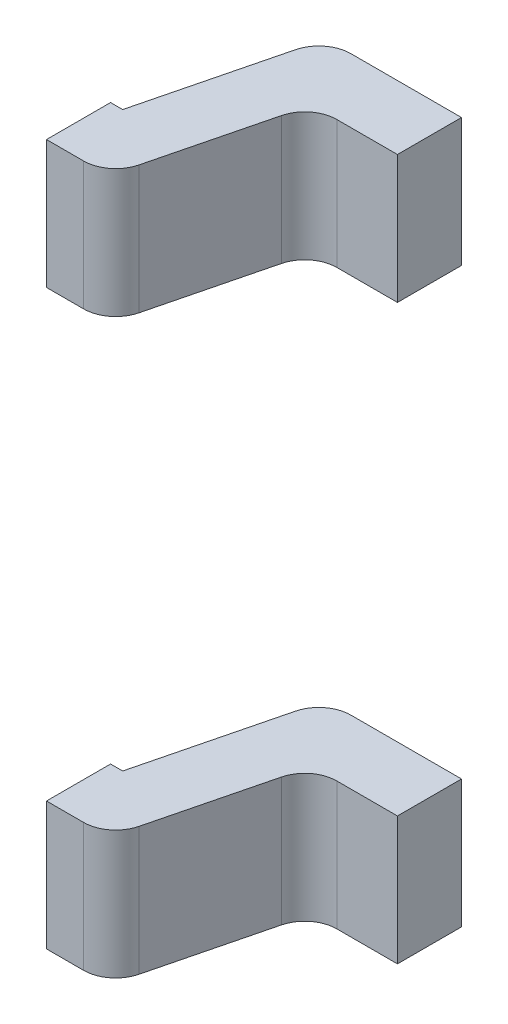
ISO-10303-21;
HEADER;
FILE_DESCRIPTION(('STEP AP214'),'2;1');
FILE_NAME('part.step','',(''),(''),'','','');
FILE_SCHEMA(('AUTOMOTIVE_DESIGN { 1 0 10303 214 1 1 1 1 }'));
ENDSEC;
DATA;
#1=APPLICATION_CONTEXT('core data for automotive mechanical design processes');
#2=APPLICATION_PROTOCOL_DEFINITION('international standard','automotive_design',2000,#1);
#3=PRODUCT_CONTEXT('',#1,'mechanical');
#4=PRODUCT('Part','Part','',(#3));
#5=PRODUCT_RELATED_PRODUCT_CATEGORY('part','',(#4));
#6=PRODUCT_DEFINITION_FORMATION('','',#4);
#7=PRODUCT_DEFINITION_CONTEXT('part definition',#1,'design');
#8=PRODUCT_DEFINITION('design','',#6,#7);
#9=PRODUCT_DEFINITION_SHAPE('','',#8);
#10=(LENGTH_UNIT() NAMED_UNIT(*) SI_UNIT(.MILLI.,.METRE.));
#11=(NAMED_UNIT(*) PLANE_ANGLE_UNIT() SI_UNIT($,.RADIAN.));
#12=(NAMED_UNIT(*) SI_UNIT($,.STERADIAN.) SOLID_ANGLE_UNIT());
#13=UNCERTAINTY_MEASURE_WITH_UNIT(LENGTH_MEASURE(1.E-05),#10,'distance_accuracy_value','');
#14=(GEOMETRIC_REPRESENTATION_CONTEXT(3) GLOBAL_UNCERTAINTY_ASSIGNED_CONTEXT((#13)) GLOBAL_UNIT_ASSIGNED_CONTEXT((#10,
#11,#12)) REPRESENTATION_CONTEXT('',''));
#15=CARTESIAN_POINT('',(0.,0.,0.));
#16=DIRECTION('',(0.,0.,1.));
#17=DIRECTION('',(1.,0.,0.));
#18=AXIS2_PLACEMENT_3D('',#15,#16,#17);
#19=CARTESIAN_POINT('',(1.071722354756,1.1625,0.323542364223));
#20=DIRECTION('',(0.,1.,0.));
#21=DIRECTION('',(-1.,0.,0.));
#22=AXIS2_PLACEMENT_3D('',#19,#20,#21);
#23=PLANE('',#22);
#24=DIRECTION('',(1.,0.,0.));
#25=VECTOR('',#24,1.);
#26=CARTESIAN_POINT('',(0.975,1.1625,0.2125));
#27=LINE('',#26,#25);
#28=CARTESIAN_POINT('',(1.425,1.1625,0.2125));
#29=VERTEX_POINT('',#28);
#30=CARTESIAN_POINT('',(1.223872479541,1.1625,0.2125));
#31=VERTEX_POINT('',#30);
#32=EDGE_CURVE('P0_E86',#29,#31,#27,.F.);
#33=ORIENTED_EDGE('',*,*,#32,.F.);
#34=DIRECTION('',(0.,0.,-1.));
#35=VECTOR('',#34,1.);
#36=CARTESIAN_POINT('',(1.425,1.1625,0.));
#37=LINE('',#36,#35);
#38=CARTESIAN_POINT('',(1.425,1.1625,0.));
#39=VERTEX_POINT('',#38);
#40=EDGE_CURVE('P0_E105',#39,#29,#37,.F.);
#41=ORIENTED_EDGE('',*,*,#40,.F.);
#42=DIRECTION('',(1.,0.,0.));
#43=VECTOR('',#42,1.);
#44=CARTESIAN_POINT('',(0.975,1.1625,0.));
#45=LINE('',#44,#43);
#46=CARTESIAN_POINT('',(1.05795749318,1.1625,0.));
#47=VERTEX_POINT('',#46);
#48=EDGE_CURVE('P0_E129',#39,#47,#45,.F.);
#49=ORIENTED_EDGE('',*,*,#48,.T.);
#50=CARTESIAN_POINT('',(1.05795749318,1.1625,0.10625));
#51=DIRECTION('',(0.,1.,0.));
#52=DIRECTION('',(0.,0.,1.));
#53=AXIS2_PLACEMENT_3D('',#50,#51,#52);
#54=CIRCLE('',#53,0.10625);
#55=CARTESIAN_POINT('',(0.954879852539799,1.1625,0.0804805898399079));
#56=VERTEX_POINT('',#55);
#57=EDGE_CURVE('P0_E176',#56,#47,#54,.F.);
#58=ORIENTED_EDGE('',*,*,#57,.F.);
#59=DIRECTION('',(0.242535625036098,0.,-0.970142500145391));
#60=VECTOR('',#59,1.);
#61=CARTESIAN_POINT('',(0.975,1.1625,0.));
#62=LINE('',#61,#60);
#63=CARTESIAN_POINT('',(0.840240294920131,1.1625,0.539038820320022));
#64=VERTEX_POINT('',#63);
#65=EDGE_CURVE('P0_E135',#56,#64,#62,.F.);
#66=ORIENTED_EDGE('',*,*,#65,.T.);
#67=DIRECTION('',(1.,0.,0.));
#68=VECTOR('',#67,1.);
#69=CARTESIAN_POINT('',(0.8,1.1625,0.53903882032));
#70=LINE('',#69,#68);
#71=CARTESIAN_POINT('',(0.8,1.1625,0.53903882032));
#72=VERTEX_POINT('',#71);
#73=EDGE_CURVE('P0_E142',#64,#72,#70,.F.);
#74=ORIENTED_EDGE('',*,*,#73,.T.);
#75=DIRECTION('',(0.,0.,-1.));
#76=VECTOR('',#75,1.);
#77=CARTESIAN_POINT('',(0.8,1.1625,0.53903882032));
#78=LINE('',#77,#76);
#79=CARTESIAN_POINT('',(0.8,1.1625,0.75153882032));
#80=VERTEX_POINT('',#79);
#81=EDGE_CURVE('P0_E148',#72,#80,#78,.F.);
#82=ORIENTED_EDGE('',*,*,#81,.T.);
#83=DIRECTION('',(1.,0.,0.));
#84=VECTOR('',#83,1.);
#85=CARTESIAN_POINT('',(0.8,1.1625,0.75153882032));
#86=LINE('',#85,#84);
#87=CARTESIAN_POINT('',(0.9231977881,1.1625,0.75153882032));
#88=VERTEX_POINT('',#87);
#89=EDGE_CURVE('P0_E154',#88,#80,#86,.F.);
#90=ORIENTED_EDGE('',*,*,#89,.F.);
#91=CARTESIAN_POINT('',(0.9231977881,1.1625,0.64528882032));
#92=DIRECTION('',(0.,1.,0.));
#93=DIRECTION('',(0.,0.,1.));
#94=AXIS2_PLACEMENT_3D('',#91,#92,#93);
#95=CIRCLE('',#94,0.10625);
#96=CARTESIAN_POINT('',(1.02627542874083,1.1625,0.671058230480068));
#97=VERTEX_POINT('',#96);
#98=EDGE_CURVE('P0_E157',#97,#88,#95,.F.);
#99=ORIENTED_EDGE('',*,*,#98,.F.);
#100=DIRECTION('',(0.242535625036098,0.,-0.970142500145391));
#101=VECTOR('',#100,1.);
#102=CARTESIAN_POINT('',(1.181155281281,1.1625,0.05153882032022));
#103=LINE('',#102,#101);
#104=CARTESIAN_POINT('',(1.12079483890111,1.1625,0.29298058984004));
#105=VERTEX_POINT('',#104);
#106=EDGE_CURVE('P0_E160',#105,#97,#103,.F.);
#107=ORIENTED_EDGE('',*,*,#106,.F.);
#108=CARTESIAN_POINT('',(1.223872479541,1.1625,0.31875));
#109=DIRECTION('',(0.,1.,0.));
#110=DIRECTION('',(0.,0.,1.));
#111=AXIS2_PLACEMENT_3D('',#108,#109,#110);
#112=CIRCLE('',#111,0.10625);
#113=EDGE_CURVE('P0_E20',#105,#31,#112,.F.);
#114=ORIENTED_EDGE('',*,*,#113,.T.);
#115=EDGE_LOOP('',(#33,#41,#49,#58,#66,#74,#82,#90,#99,#107,#114));
#116=FACE_BOUND('',#115,.T.);
#117=ADVANCED_FACE('P0_F17',(#116),#23,.T.);
#118=CARTESIAN_POINT('',(0.975,0.7375,0.));
#119=DIRECTION('',(0.,0.,1.));
#120=DIRECTION('',(1.,0.,0.));
#121=AXIS2_PLACEMENT_3D('',#118,#119,#120);
#122=PLANE('',#121);
#123=ORIENTED_EDGE('',*,*,#48,.F.);
#124=DIRECTION('',(0.,1.,0.));
#125=VECTOR('',#124,1.);
#126=CARTESIAN_POINT('',(1.425,0.7375,0.));
#127=LINE('',#126,#125);
#128=CARTESIAN_POINT('',(1.425,0.7375,0.));
#129=VERTEX_POINT('',#128);
#130=EDGE_CURVE('P0_E94',#129,#39,#127,.T.);
#131=ORIENTED_EDGE('',*,*,#130,.F.);
#132=DIRECTION('',(1.,0.,0.));
#133=VECTOR('',#132,1.);
#134=CARTESIAN_POINT('',(1.071722354756,0.7375,0.));
#135=LINE('',#134,#133);
#136=CARTESIAN_POINT('',(1.05795749318,0.7375,0.));
#137=VERTEX_POINT('',#136);
#138=EDGE_CURVE('P0_E119',#137,#129,#135,.T.);
#139=ORIENTED_EDGE('',*,*,#138,.F.);
#140=DIRECTION('',(0.,1.,0.));
#141=VECTOR('',#140,1.);
#142=CARTESIAN_POINT('',(1.05795749318,0.7375,0.));
#143=LINE('',#142,#141);
#144=EDGE_CURVE('P0_E121',#47,#137,#143,.F.);
#145=ORIENTED_EDGE('',*,*,#144,.F.);
#146=EDGE_LOOP('',(#123,#131,#139,#145));
#147=FACE_BOUND('',#146,.T.);
#148=ADVANCED_FACE('P0_F254',(#147),#122,.F.);
#149=CARTESIAN_POINT('',(1.425,0.7375,0.));
#150=DIRECTION('',(1.,0.,0.));
#151=DIRECTION('',(0.,0.,-1.));
#152=AXIS2_PLACEMENT_3D('',#149,#150,#151);
#153=PLANE('',#152);
#154=ORIENTED_EDGE('',*,*,#40,.T.);
#155=DIRECTION('',(0.,1.,0.));
#156=VECTOR('',#155,1.);
#157=CARTESIAN_POINT('',(1.425,0.7375,0.2125));
#158=LINE('',#157,#156);
#159=CARTESIAN_POINT('',(1.425,0.7375,0.2125));
#160=VERTEX_POINT('',#159);
#161=EDGE_CURVE('P0_E99',#160,#29,#158,.T.);
#162=ORIENTED_EDGE('',*,*,#161,.F.);
#163=DIRECTION('',(0.,0.,-1.));
#164=VECTOR('',#163,1.);
#165=CARTESIAN_POINT('',(1.425,0.7375,0.323542364223));
#166=LINE('',#165,#164);
#167=EDGE_CURVE('P0_E103',#129,#160,#166,.F.);
#168=ORIENTED_EDGE('',*,*,#167,.F.);
#169=ORIENTED_EDGE('',*,*,#130,.T.);
#170=EDGE_LOOP('',(#154,#162,#168,#169));
#171=FACE_BOUND('',#170,.T.);
#172=ADVANCED_FACE('P0_F101',(#171),#153,.T.);
#173=CARTESIAN_POINT('',(0.975,0.7375,0.2125));
#174=DIRECTION('',(0.,0.,1.));
#175=DIRECTION('',(1.,0.,0.));
#176=AXIS2_PLACEMENT_3D('',#173,#174,#175);
#177=PLANE('',#176);
#178=DIRECTION('',(1.,0.,0.));
#179=VECTOR('',#178,1.);
#180=CARTESIAN_POINT('',(1.071722354756,0.7375,0.2125));
#181=LINE('',#180,#179);
#182=CARTESIAN_POINT('',(1.223872479541,0.7375,0.2125));
#183=VERTEX_POINT('',#182);
#184=EDGE_CURVE('P0_E109',#160,#183,#181,.F.);
#185=ORIENTED_EDGE('',*,*,#184,.F.);
#186=ORIENTED_EDGE('',*,*,#161,.T.);
#187=ORIENTED_EDGE('',*,*,#32,.T.);
#188=DIRECTION('',(0.,1.,0.));
#189=VECTOR('',#188,1.);
#190=CARTESIAN_POINT('',(1.223872479541,0.7375,0.2125));
#191=LINE('',#190,#189);
#192=EDGE_CURVE('P0_E111',#31,#183,#191,.F.);
#193=ORIENTED_EDGE('',*,*,#192,.T.);
#194=EDGE_LOOP('',(#185,#186,#187,#193));
#195=FACE_BOUND('',#194,.T.);
#196=ADVANCED_FACE('P0_F110',(#195),#177,.T.);
#197=CARTESIAN_POINT('',(1.223872479541,0.7375,0.31875));
#198=DIRECTION('',(0.,1.,0.));
#199=DIRECTION('',(0.,0.,1.));
#200=AXIS2_PLACEMENT_3D('',#197,#198,#199);
#201=CYLINDRICAL_SURFACE('',#200,0.10625);
#202=ORIENTED_EDGE('',*,*,#113,.F.);
#203=DIRECTION('',(0.,1.,0.));
#204=VECTOR('',#203,1.);
#205=CARTESIAN_POINT('',(1.12079483890111,0.7375,0.292980589840028));
#206=LINE('',#205,#204);
#207=CARTESIAN_POINT('',(1.12079483890106,0.7375,0.292980589840014));
#208=VERTEX_POINT('',#207);
#209=EDGE_CURVE('P0_E163',#208,#105,#206,.T.);
#210=ORIENTED_EDGE('',*,*,#209,.F.);
#211=CARTESIAN_POINT('',(1.223872479541,0.7375,0.31875));
#212=DIRECTION('',(0.,1.,0.));
#213=DIRECTION('',(0.,0.,1.));
#214=AXIS2_PLACEMENT_3D('',#211,#212,#213);
#215=CIRCLE('',#214,0.10625);
#216=EDGE_CURVE('P0_E115',#183,#208,#215,.T.);
#217=ORIENTED_EDGE('',*,*,#216,.F.);
#218=ORIENTED_EDGE('',*,*,#192,.F.);
#219=EDGE_LOOP('',(#202,#210,#217,#218));
#220=FACE_BOUND('',#219,.T.);
#221=ADVANCED_FACE('P0_F194',(#220),#201,.F.);
#222=CARTESIAN_POINT('',(1.181155281281,0.7375,0.05153882032022));
#223=DIRECTION('',(0.970142500145391,0.,0.242535625036098));
#224=DIRECTION('',(0.242535625036098,0.,-0.970142500145391));
#225=AXIS2_PLACEMENT_3D('',#222,#223,#224);
#226=PLANE('',#225);
#227=ORIENTED_EDGE('',*,*,#106,.T.);
#228=DIRECTION('',(0.,1.,0.));
#229=VECTOR('',#228,1.);
#230=CARTESIAN_POINT('',(1.0262754287405,0.7375,0.671058230479875));
#231=LINE('',#230,#229);
#232=CARTESIAN_POINT('',(1.02627542874072,0.7375,0.671058230480055));
#233=VERTEX_POINT('',#232);
#234=EDGE_CURVE('P0_E162',#233,#97,#231,.T.);
#235=ORIENTED_EDGE('',*,*,#234,.F.);
#236=DIRECTION('',(-0.242535625036333,0.,0.970142500145332));
#237=VECTOR('',#236,1.);
#238=CARTESIAN_POINT('',(1.120794838901,0.7375,0.29298058984));
#239=LINE('',#238,#237);
#240=EDGE_CURVE('P0_E174',#208,#233,#239,.T.);
#241=ORIENTED_EDGE('',*,*,#240,.F.);
#242=ORIENTED_EDGE('',*,*,#209,.T.);
#243=EDGE_LOOP('',(#227,#235,#241,#242));
#244=FACE_BOUND('',#243,.T.);
#245=ADVANCED_FACE('P0_F192',(#244),#226,.T.);
#246=CARTESIAN_POINT('',(0.9231977881,0.7375,0.64528882032));
#247=DIRECTION('',(0.,1.,0.));
#248=DIRECTION('',(0.,0.,1.));
#249=AXIS2_PLACEMENT_3D('',#246,#247,#248);
#250=CYLINDRICAL_SURFACE('',#249,0.10625);
#251=DIRECTION('',(0.,1.,0.));
#252=VECTOR('',#251,1.);
#253=CARTESIAN_POINT('',(0.9231977881,0.7375,0.75153882032));
#254=LINE('',#253,#252);
#255=CARTESIAN_POINT('',(0.9231977881,0.7375,0.75153882032));
#256=VERTEX_POINT('',#255);
#257=EDGE_CURVE('P0_E151',#256,#88,#254,.T.);
#258=ORIENTED_EDGE('',*,*,#257,.F.);
#259=CARTESIAN_POINT('',(0.9231977881,0.7375,0.64528882032));
#260=DIRECTION('',(0.,1.,0.));
#261=DIRECTION('',(0.,0.,1.));
#262=AXIS2_PLACEMENT_3D('',#259,#260,#261);
#263=CIRCLE('',#262,0.10625);
#264=EDGE_CURVE('P0_E170',#233,#256,#263,.F.);
#265=ORIENTED_EDGE('',*,*,#264,.F.);
#266=ORIENTED_EDGE('',*,*,#234,.T.);
#267=ORIENTED_EDGE('',*,*,#98,.T.);
#268=EDGE_LOOP('',(#258,#265,#266,#267));
#269=FACE_BOUND('',#268,.T.);
#270=ADVANCED_FACE('P0_F277',(#269),#250,.T.);
#271=CARTESIAN_POINT('',(0.8,0.7375,0.75153882032));
#272=DIRECTION('',(0.,0.,1.));
#273=DIRECTION('',(1.,0.,0.));
#274=AXIS2_PLACEMENT_3D('',#271,#272,#273);
#275=PLANE('',#274);
#276=DIRECTION('',(1.,0.,0.));
#277=VECTOR('',#276,1.);
#278=CARTESIAN_POINT('',(1.071722354756,0.7375,0.75153882032));
#279=LINE('',#278,#277);
#280=CARTESIAN_POINT('',(0.8,0.7375,0.75153882032));
#281=VERTEX_POINT('',#280);
#282=EDGE_CURVE('P0_E173',#256,#281,#279,.F.);
#283=ORIENTED_EDGE('',*,*,#282,.F.);
#284=ORIENTED_EDGE('',*,*,#257,.T.);
#285=ORIENTED_EDGE('',*,*,#89,.T.);
#286=DIRECTION('',(0.,1.,0.));
#287=VECTOR('',#286,1.);
#288=CARTESIAN_POINT('',(0.8,0.7375,0.75153882032));
#289=LINE('',#288,#287);
#290=EDGE_CURVE('P0_E145',#80,#281,#289,.F.);
#291=ORIENTED_EDGE('',*,*,#290,.T.);
#292=EDGE_LOOP('',(#283,#284,#285,#291));
#293=FACE_BOUND('',#292,.T.);
#294=ADVANCED_FACE('P0_F231',(#293),#275,.T.);
#295=CARTESIAN_POINT('',(0.8,0.7375,0.53903882032));
#296=DIRECTION('',(1.,0.,0.));
#297=DIRECTION('',(0.,0.,-1.));
#298=AXIS2_PLACEMENT_3D('',#295,#296,#297);
#299=PLANE('',#298);
#300=ORIENTED_EDGE('',*,*,#290,.F.);
#301=ORIENTED_EDGE('',*,*,#81,.F.);
#302=DIRECTION('',(0.,1.,0.));
#303=VECTOR('',#302,1.);
#304=CARTESIAN_POINT('',(0.8,0.7375,0.53903882032));
#305=LINE('',#304,#303);
#306=CARTESIAN_POINT('',(0.8,0.7375,0.53903882032));
#307=VERTEX_POINT('',#306);
#308=EDGE_CURVE('P0_E139',#72,#307,#305,.F.);
#309=ORIENTED_EDGE('',*,*,#308,.T.);
#310=DIRECTION('',(0.,0.,-1.));
#311=VECTOR('',#310,1.);
#312=CARTESIAN_POINT('',(0.8,0.7375,0.323542364223));
#313=LINE('',#312,#311);
#314=EDGE_CURVE('P0_E214',#281,#307,#313,.T.);
#315=ORIENTED_EDGE('',*,*,#314,.F.);
#316=EDGE_LOOP('',(#300,#301,#309,#315));
#317=FACE_BOUND('',#316,.T.);
#318=ADVANCED_FACE('P0_F235',(#317),#299,.F.);
#319=CARTESIAN_POINT('',(0.8,0.7375,0.53903882032));
#320=DIRECTION('',(0.,0.,1.));
#321=DIRECTION('',(1.,0.,0.));
#322=AXIS2_PLACEMENT_3D('',#319,#320,#321);
#323=PLANE('',#322);
#324=DIRECTION('',(1.,0.,0.));
#325=VECTOR('',#324,1.);
#326=CARTESIAN_POINT('',(1.071722354756,0.7375,0.53903882032));
#327=LINE('',#326,#325);
#328=CARTESIAN_POINT('',(0.840240294920043,0.7375,0.539038820320011));
#329=VERTEX_POINT('',#328);
#330=EDGE_CURVE('P0_E211',#307,#329,#327,.T.);
#331=ORIENTED_EDGE('',*,*,#330,.F.);
#332=ORIENTED_EDGE('',*,*,#308,.F.);
#333=ORIENTED_EDGE('',*,*,#73,.F.);
#334=DIRECTION('',(0.,1.,0.));
#335=VECTOR('',#334,1.);
#336=CARTESIAN_POINT('',(0.840240294920131,0.7375,0.539038820320033));
#337=LINE('',#336,#335);
#338=EDGE_CURVE('P0_E138',#64,#329,#337,.F.);
#339=ORIENTED_EDGE('',*,*,#338,.T.);
#340=EDGE_LOOP('',(#331,#332,#333,#339));
#341=FACE_BOUND('',#340,.T.);
#342=ADVANCED_FACE('P0_F248',(#341),#323,.F.);
#343=CARTESIAN_POINT('',(0.975,0.7375,0.));
#344=DIRECTION('',(0.970142500145391,0.,0.242535625036098));
#345=DIRECTION('',(0.242535625036098,0.,-0.970142500145391));
#346=AXIS2_PLACEMENT_3D('',#343,#344,#345);
#347=PLANE('',#346);
#348=ORIENTED_EDGE('',*,*,#65,.F.);
#349=DIRECTION('',(0.,1.,0.));
#350=VECTOR('',#349,1.);
#351=CARTESIAN_POINT('',(0.954879852539584,0.7375,0.0804805898397861));
#352=LINE('',#351,#350);
#353=CARTESIAN_POINT('',(0.954879852539779,0.7375,0.0804805898398927));
#354=VERTEX_POINT('',#353);
#355=EDGE_CURVE('P0_E35',#354,#56,#352,.T.);
#356=ORIENTED_EDGE('',*,*,#355,.F.);
#357=DIRECTION('',(0.242535625036278,0.,-0.970142500145346));
#358=VECTOR('',#357,1.);
#359=CARTESIAN_POINT('',(0.84024029492,0.7375,0.53903882032));
#360=LINE('',#359,#358);
#361=EDGE_CURVE('P0_E26',#329,#354,#360,.T.);
#362=ORIENTED_EDGE('',*,*,#361,.F.);
#363=ORIENTED_EDGE('',*,*,#338,.F.);
#364=EDGE_LOOP('',(#348,#356,#362,#363));
#365=FACE_BOUND('',#364,.T.);
#366=ADVANCED_FACE('P0_F242',(#365),#347,.F.);
#367=CARTESIAN_POINT('',(1.05795749318,0.7375,0.10625));
#368=DIRECTION('',(0.,1.,0.));
#369=DIRECTION('',(0.,0.,1.));
#370=AXIS2_PLACEMENT_3D('',#367,#368,#369);
#371=CYLINDRICAL_SURFACE('',#370,0.10625);
#372=ORIENTED_EDGE('',*,*,#57,.T.);
#373=ORIENTED_EDGE('',*,*,#144,.T.);
#374=CARTESIAN_POINT('',(1.05795749318,0.7375,0.10625));
#375=DIRECTION('',(0.,1.,0.));
#376=DIRECTION('',(0.,0.,1.));
#377=AXIS2_PLACEMENT_3D('',#374,#375,#376);
#378=CIRCLE('',#377,0.10625);
#379=EDGE_CURVE('P0_E11',#354,#137,#378,.F.);
#380=ORIENTED_EDGE('',*,*,#379,.F.);
#381=ORIENTED_EDGE('',*,*,#355,.T.);
#382=EDGE_LOOP('',(#372,#373,#380,#381));
#383=FACE_BOUND('',#382,.T.);
#384=ADVANCED_FACE('P0_F253',(#383),#371,.T.);
#385=CARTESIAN_POINT('',(1.071722354756,0.7375,0.323542364223));
#386=DIRECTION('',(0.,-1.,0.));
#387=DIRECTION('',(0.,0.,-1.));
#388=AXIS2_PLACEMENT_3D('',#385,#386,#387);
#389=PLANE('',#388);
#390=ORIENTED_EDGE('',*,*,#361,.T.);
#391=ORIENTED_EDGE('',*,*,#379,.T.);
#392=ORIENTED_EDGE('',*,*,#138,.T.);
#393=ORIENTED_EDGE('',*,*,#167,.T.);
#394=ORIENTED_EDGE('',*,*,#184,.T.);
#395=ORIENTED_EDGE('',*,*,#216,.T.);
#396=ORIENTED_EDGE('',*,*,#240,.T.);
#397=ORIENTED_EDGE('',*,*,#264,.T.);
#398=ORIENTED_EDGE('',*,*,#282,.T.);
#399=ORIENTED_EDGE('',*,*,#314,.T.);
#400=ORIENTED_EDGE('',*,*,#330,.T.);
#401=EDGE_LOOP('',(#390,#391,#392,#393,#394,#395,#396,#397,#398,#399,#400));
#402=FACE_BOUND('',#401,.T.);
#403=ADVANCED_FACE('P0_F118',(#402),#389,.T.);
#404=CLOSED_SHELL('',(#117,#148,#172,#196,#221,#245,#270,#294,#318,#342,#366,#384,#403));
#405=MANIFOLD_SOLID_BREP('P0_B1',#404);
#406=CARTESIAN_POINT('',(1.071722354756,-0.7375,0.323542364223));
#407=DIRECTION('',(0.,1.,0.));
#408=DIRECTION('',(-1.,0.,0.));
#409=AXIS2_PLACEMENT_3D('',#406,#407,#408);
#410=PLANE('',#409);
#411=DIRECTION('',(1.,0.,0.));
#412=VECTOR('',#411,1.);
#413=CARTESIAN_POINT('',(0.975,-0.7375,0.2125));
#414=LINE('',#413,#412);
#415=CARTESIAN_POINT('',(1.425,-0.7375,0.2125));
#416=VERTEX_POINT('',#415);
#417=CARTESIAN_POINT('',(1.223872479541,-0.7375,0.2125));
#418=VERTEX_POINT('',#417);
#419=EDGE_CURVE('P1_E86',#416,#418,#414,.F.);
#420=ORIENTED_EDGE('',*,*,#419,.F.);
#421=DIRECTION('',(0.,0.,-1.));
#422=VECTOR('',#421,1.);
#423=CARTESIAN_POINT('',(1.425,-0.7375,0.));
#424=LINE('',#423,#422);
#425=CARTESIAN_POINT('',(1.425,-0.7375,0.));
#426=VERTEX_POINT('',#425);
#427=EDGE_CURVE('P1_E105',#426,#416,#424,.F.);
#428=ORIENTED_EDGE('',*,*,#427,.F.);
#429=DIRECTION('',(1.,0.,0.));
#430=VECTOR('',#429,1.);
#431=CARTESIAN_POINT('',(0.975,-0.7375,0.));
#432=LINE('',#431,#430);
#433=CARTESIAN_POINT('',(1.05795749318,-0.7375,0.));
#434=VERTEX_POINT('',#433);
#435=EDGE_CURVE('P1_E129',#426,#434,#432,.F.);
#436=ORIENTED_EDGE('',*,*,#435,.T.);
#437=CARTESIAN_POINT('',(1.05795749318,-0.7375,0.10625));
#438=DIRECTION('',(0.,1.,0.));
#439=DIRECTION('',(0.,0.,1.));
#440=AXIS2_PLACEMENT_3D('',#437,#438,#439);
#441=CIRCLE('',#440,0.10625);
#442=CARTESIAN_POINT('',(0.954879852539799,-0.7375,0.0804805898399079));
#443=VERTEX_POINT('',#442);
#444=EDGE_CURVE('P1_E176',#443,#434,#441,.F.);
#445=ORIENTED_EDGE('',*,*,#444,.F.);
#446=DIRECTION('',(0.242535625036098,0.,-0.970142500145391));
#447=VECTOR('',#446,1.);
#448=CARTESIAN_POINT('',(0.975,-0.7375,0.));
#449=LINE('',#448,#447);
#450=CARTESIAN_POINT('',(0.840240294920131,-0.7375,0.539038820320022));
#451=VERTEX_POINT('',#450);
#452=EDGE_CURVE('P1_E135',#443,#451,#449,.F.);
#453=ORIENTED_EDGE('',*,*,#452,.T.);
#454=DIRECTION('',(1.,0.,0.));
#455=VECTOR('',#454,1.);
#456=CARTESIAN_POINT('',(0.8,-0.7375,0.53903882032));
#457=LINE('',#456,#455);
#458=CARTESIAN_POINT('',(0.8,-0.7375,0.53903882032));
#459=VERTEX_POINT('',#458);
#460=EDGE_CURVE('P1_E142',#451,#459,#457,.F.);
#461=ORIENTED_EDGE('',*,*,#460,.T.);
#462=DIRECTION('',(0.,0.,-1.));
#463=VECTOR('',#462,1.);
#464=CARTESIAN_POINT('',(0.8,-0.7375,0.53903882032));
#465=LINE('',#464,#463);
#466=CARTESIAN_POINT('',(0.8,-0.7375,0.75153882032));
#467=VERTEX_POINT('',#466);
#468=EDGE_CURVE('P1_E148',#459,#467,#465,.F.);
#469=ORIENTED_EDGE('',*,*,#468,.T.);
#470=DIRECTION('',(1.,0.,0.));
#471=VECTOR('',#470,1.);
#472=CARTESIAN_POINT('',(0.8,-0.7375,0.75153882032));
#473=LINE('',#472,#471);
#474=CARTESIAN_POINT('',(0.9231977881,-0.7375,0.75153882032));
#475=VERTEX_POINT('',#474);
#476=EDGE_CURVE('P1_E154',#475,#467,#473,.F.);
#477=ORIENTED_EDGE('',*,*,#476,.F.);
#478=CARTESIAN_POINT('',(0.9231977881,-0.7375,0.64528882032));
#479=DIRECTION('',(0.,1.,0.));
#480=DIRECTION('',(0.,0.,1.));
#481=AXIS2_PLACEMENT_3D('',#478,#479,#480);
#482=CIRCLE('',#481,0.10625);
#483=CARTESIAN_POINT('',(1.02627542874083,-0.7375,0.671058230480068));
#484=VERTEX_POINT('',#483);
#485=EDGE_CURVE('P1_E157',#484,#475,#482,.F.);
#486=ORIENTED_EDGE('',*,*,#485,.F.);
#487=DIRECTION('',(0.242535625036098,0.,-0.970142500145391));
#488=VECTOR('',#487,1.);
#489=CARTESIAN_POINT('',(1.181155281281,-0.7375,0.05153882032022));
#490=LINE('',#489,#488);
#491=CARTESIAN_POINT('',(1.12079483890111,-0.7375,0.29298058984004));
#492=VERTEX_POINT('',#491);
#493=EDGE_CURVE('P1_E160',#492,#484,#490,.F.);
#494=ORIENTED_EDGE('',*,*,#493,.F.);
#495=CARTESIAN_POINT('',(1.223872479541,-0.7375,0.31875));
#496=DIRECTION('',(0.,1.,0.));
#497=DIRECTION('',(0.,0.,1.));
#498=AXIS2_PLACEMENT_3D('',#495,#496,#497);
#499=CIRCLE('',#498,0.10625);
#500=EDGE_CURVE('P1_E20',#492,#418,#499,.F.);
#501=ORIENTED_EDGE('',*,*,#500,.T.);
#502=EDGE_LOOP('',(#420,#428,#436,#445,#453,#461,#469,#477,#486,#494,#501));
#503=FACE_BOUND('',#502,.T.);
#504=ADVANCED_FACE('P1_F17',(#503),#410,.T.);
#505=CARTESIAN_POINT('',(0.975,-1.1625,0.));
#506=DIRECTION('',(0.,0.,1.));
#507=DIRECTION('',(1.,0.,0.));
#508=AXIS2_PLACEMENT_3D('',#505,#506,#507);
#509=PLANE('',#508);
#510=ORIENTED_EDGE('',*,*,#435,.F.);
#511=DIRECTION('',(0.,1.,0.));
#512=VECTOR('',#511,1.);
#513=CARTESIAN_POINT('',(1.425,-1.1625,0.));
#514=LINE('',#513,#512);
#515=CARTESIAN_POINT('',(1.425,-1.1625,0.));
#516=VERTEX_POINT('',#515);
#517=EDGE_CURVE('P1_E94',#516,#426,#514,.T.);
#518=ORIENTED_EDGE('',*,*,#517,.F.);
#519=DIRECTION('',(1.,0.,0.));
#520=VECTOR('',#519,1.);
#521=CARTESIAN_POINT('',(1.071722354756,-1.1625,0.));
#522=LINE('',#521,#520);
#523=CARTESIAN_POINT('',(1.05795749318,-1.1625,0.));
#524=VERTEX_POINT('',#523);
#525=EDGE_CURVE('P1_E119',#524,#516,#522,.T.);
#526=ORIENTED_EDGE('',*,*,#525,.F.);
#527=DIRECTION('',(0.,1.,0.));
#528=VECTOR('',#527,1.);
#529=CARTESIAN_POINT('',(1.05795749318,-1.1625,0.));
#530=LINE('',#529,#528);
#531=EDGE_CURVE('P1_E121',#434,#524,#530,.F.);
#532=ORIENTED_EDGE('',*,*,#531,.F.);
#533=EDGE_LOOP('',(#510,#518,#526,#532));
#534=FACE_BOUND('',#533,.T.);
#535=ADVANCED_FACE('P1_F254',(#534),#509,.F.);
#536=CARTESIAN_POINT('',(1.425,-1.1625,0.));
#537=DIRECTION('',(1.,0.,0.));
#538=DIRECTION('',(0.,0.,-1.));
#539=AXIS2_PLACEMENT_3D('',#536,#537,#538);
#540=PLANE('',#539);
#541=ORIENTED_EDGE('',*,*,#427,.T.);
#542=DIRECTION('',(0.,1.,0.));
#543=VECTOR('',#542,1.);
#544=CARTESIAN_POINT('',(1.425,-1.1625,0.2125));
#545=LINE('',#544,#543);
#546=CARTESIAN_POINT('',(1.425,-1.1625,0.2125));
#547=VERTEX_POINT('',#546);
#548=EDGE_CURVE('P1_E99',#547,#416,#545,.T.);
#549=ORIENTED_EDGE('',*,*,#548,.F.);
#550=DIRECTION('',(0.,0.,-1.));
#551=VECTOR('',#550,1.);
#552=CARTESIAN_POINT('',(1.425,-1.1625,0.323542364223));
#553=LINE('',#552,#551);
#554=EDGE_CURVE('P1_E103',#516,#547,#553,.F.);
#555=ORIENTED_EDGE('',*,*,#554,.F.);
#556=ORIENTED_EDGE('',*,*,#517,.T.);
#557=EDGE_LOOP('',(#541,#549,#555,#556));
#558=FACE_BOUND('',#557,.T.);
#559=ADVANCED_FACE('P1_F101',(#558),#540,.T.);
#560=CARTESIAN_POINT('',(0.975,-1.1625,0.2125));
#561=DIRECTION('',(0.,0.,1.));
#562=DIRECTION('',(1.,0.,0.));
#563=AXIS2_PLACEMENT_3D('',#560,#561,#562);
#564=PLANE('',#563);
#565=DIRECTION('',(1.,0.,0.));
#566=VECTOR('',#565,1.);
#567=CARTESIAN_POINT('',(1.071722354756,-1.1625,0.2125));
#568=LINE('',#567,#566);
#569=CARTESIAN_POINT('',(1.223872479541,-1.1625,0.2125));
#570=VERTEX_POINT('',#569);
#571=EDGE_CURVE('P1_E109',#547,#570,#568,.F.);
#572=ORIENTED_EDGE('',*,*,#571,.F.);
#573=ORIENTED_EDGE('',*,*,#548,.T.);
#574=ORIENTED_EDGE('',*,*,#419,.T.);
#575=DIRECTION('',(0.,1.,0.));
#576=VECTOR('',#575,1.);
#577=CARTESIAN_POINT('',(1.223872479541,-1.1625,0.2125));
#578=LINE('',#577,#576);
#579=EDGE_CURVE('P1_E111',#418,#570,#578,.F.);
#580=ORIENTED_EDGE('',*,*,#579,.T.);
#581=EDGE_LOOP('',(#572,#573,#574,#580));
#582=FACE_BOUND('',#581,.T.);
#583=ADVANCED_FACE('P1_F110',(#582),#564,.T.);
#584=CARTESIAN_POINT('',(1.223872479541,-1.1625,0.31875));
#585=DIRECTION('',(0.,1.,0.));
#586=DIRECTION('',(0.,0.,1.));
#587=AXIS2_PLACEMENT_3D('',#584,#585,#586);
#588=CYLINDRICAL_SURFACE('',#587,0.10625);
#589=ORIENTED_EDGE('',*,*,#500,.F.);
#590=DIRECTION('',(0.,1.,0.));
#591=VECTOR('',#590,1.);
#592=CARTESIAN_POINT('',(1.12079483890111,-1.1625,0.292980589840028));
#593=LINE('',#592,#591);
#594=CARTESIAN_POINT('',(1.12079483890106,-1.1625,0.292980589840014));
#595=VERTEX_POINT('',#594);
#596=EDGE_CURVE('P1_E163',#595,#492,#593,.T.);
#597=ORIENTED_EDGE('',*,*,#596,.F.);
#598=CARTESIAN_POINT('',(1.223872479541,-1.1625,0.31875));
#599=DIRECTION('',(0.,1.,0.));
#600=DIRECTION('',(0.,0.,1.));
#601=AXIS2_PLACEMENT_3D('',#598,#599,#600);
#602=CIRCLE('',#601,0.10625);
#603=EDGE_CURVE('P1_E115',#570,#595,#602,.T.);
#604=ORIENTED_EDGE('',*,*,#603,.F.);
#605=ORIENTED_EDGE('',*,*,#579,.F.);
#606=EDGE_LOOP('',(#589,#597,#604,#605));
#607=FACE_BOUND('',#606,.T.);
#608=ADVANCED_FACE('P1_F194',(#607),#588,.F.);
#609=CARTESIAN_POINT('',(1.181155281281,-1.1625,0.05153882032022));
#610=DIRECTION('',(0.970142500145391,0.,0.242535625036098));
#611=DIRECTION('',(0.242535625036098,0.,-0.970142500145391));
#612=AXIS2_PLACEMENT_3D('',#609,#610,#611);
#613=PLANE('',#612);
#614=ORIENTED_EDGE('',*,*,#493,.T.);
#615=DIRECTION('',(0.,1.,0.));
#616=VECTOR('',#615,1.);
#617=CARTESIAN_POINT('',(1.0262754287405,-1.1625,0.671058230479875));
#618=LINE('',#617,#616);
#619=CARTESIAN_POINT('',(1.02627542874072,-1.1625,0.671058230480055));
#620=VERTEX_POINT('',#619);
#621=EDGE_CURVE('P1_E162',#620,#484,#618,.T.);
#622=ORIENTED_EDGE('',*,*,#621,.F.);
#623=DIRECTION('',(-0.242535625036333,0.,0.970142500145332));
#624=VECTOR('',#623,1.);
#625=CARTESIAN_POINT('',(1.120794838901,-1.1625,0.29298058984));
#626=LINE('',#625,#624);
#627=EDGE_CURVE('P1_E174',#595,#620,#626,.T.);
#628=ORIENTED_EDGE('',*,*,#627,.F.);
#629=ORIENTED_EDGE('',*,*,#596,.T.);
#630=EDGE_LOOP('',(#614,#622,#628,#629));
#631=FACE_BOUND('',#630,.T.);
#632=ADVANCED_FACE('P1_F192',(#631),#613,.T.);
#633=CARTESIAN_POINT('',(0.9231977881,-1.1625,0.64528882032));
#634=DIRECTION('',(0.,1.,0.));
#635=DIRECTION('',(0.,0.,1.));
#636=AXIS2_PLACEMENT_3D('',#633,#634,#635);
#637=CYLINDRICAL_SURFACE('',#636,0.10625);
#638=DIRECTION('',(0.,1.,0.));
#639=VECTOR('',#638,1.);
#640=CARTESIAN_POINT('',(0.9231977881,-1.1625,0.75153882032));
#641=LINE('',#640,#639);
#642=CARTESIAN_POINT('',(0.9231977881,-1.1625,0.75153882032));
#643=VERTEX_POINT('',#642);
#644=EDGE_CURVE('P1_E151',#643,#475,#641,.T.);
#645=ORIENTED_EDGE('',*,*,#644,.F.);
#646=CARTESIAN_POINT('',(0.9231977881,-1.1625,0.64528882032));
#647=DIRECTION('',(0.,1.,0.));
#648=DIRECTION('',(0.,0.,1.));
#649=AXIS2_PLACEMENT_3D('',#646,#647,#648);
#650=CIRCLE('',#649,0.10625);
#651=EDGE_CURVE('P1_E170',#620,#643,#650,.F.);
#652=ORIENTED_EDGE('',*,*,#651,.F.);
#653=ORIENTED_EDGE('',*,*,#621,.T.);
#654=ORIENTED_EDGE('',*,*,#485,.T.);
#655=EDGE_LOOP('',(#645,#652,#653,#654));
#656=FACE_BOUND('',#655,.T.);
#657=ADVANCED_FACE('P1_F277',(#656),#637,.T.);
#658=CARTESIAN_POINT('',(0.8,-1.1625,0.75153882032));
#659=DIRECTION('',(0.,0.,1.));
#660=DIRECTION('',(1.,0.,0.));
#661=AXIS2_PLACEMENT_3D('',#658,#659,#660);
#662=PLANE('',#661);
#663=DIRECTION('',(1.,0.,0.));
#664=VECTOR('',#663,1.);
#665=CARTESIAN_POINT('',(1.071722354756,-1.1625,0.75153882032));
#666=LINE('',#665,#664);
#667=CARTESIAN_POINT('',(0.8,-1.1625,0.75153882032));
#668=VERTEX_POINT('',#667);
#669=EDGE_CURVE('P1_E173',#643,#668,#666,.F.);
#670=ORIENTED_EDGE('',*,*,#669,.F.);
#671=ORIENTED_EDGE('',*,*,#644,.T.);
#672=ORIENTED_EDGE('',*,*,#476,.T.);
#673=DIRECTION('',(0.,1.,0.));
#674=VECTOR('',#673,1.);
#675=CARTESIAN_POINT('',(0.8,-1.1625,0.75153882032));
#676=LINE('',#675,#674);
#677=EDGE_CURVE('P1_E145',#467,#668,#676,.F.);
#678=ORIENTED_EDGE('',*,*,#677,.T.);
#679=EDGE_LOOP('',(#670,#671,#672,#678));
#680=FACE_BOUND('',#679,.T.);
#681=ADVANCED_FACE('P1_F231',(#680),#662,.T.);
#682=CARTESIAN_POINT('',(0.8,-1.1625,0.53903882032));
#683=DIRECTION('',(1.,0.,0.));
#684=DIRECTION('',(0.,0.,-1.));
#685=AXIS2_PLACEMENT_3D('',#682,#683,#684);
#686=PLANE('',#685);
#687=ORIENTED_EDGE('',*,*,#677,.F.);
#688=ORIENTED_EDGE('',*,*,#468,.F.);
#689=DIRECTION('',(0.,1.,0.));
#690=VECTOR('',#689,1.);
#691=CARTESIAN_POINT('',(0.8,-1.1625,0.53903882032));
#692=LINE('',#691,#690);
#693=CARTESIAN_POINT('',(0.8,-1.1625,0.53903882032));
#694=VERTEX_POINT('',#693);
#695=EDGE_CURVE('P1_E139',#459,#694,#692,.F.);
#696=ORIENTED_EDGE('',*,*,#695,.T.);
#697=DIRECTION('',(0.,0.,-1.));
#698=VECTOR('',#697,1.);
#699=CARTESIAN_POINT('',(0.8,-1.1625,0.323542364223));
#700=LINE('',#699,#698);
#701=EDGE_CURVE('P1_E214',#668,#694,#700,.T.);
#702=ORIENTED_EDGE('',*,*,#701,.F.);
#703=EDGE_LOOP('',(#687,#688,#696,#702));
#704=FACE_BOUND('',#703,.T.);
#705=ADVANCED_FACE('P1_F235',(#704),#686,.F.);
#706=CARTESIAN_POINT('',(0.8,-1.1625,0.53903882032));
#707=DIRECTION('',(0.,0.,1.));
#708=DIRECTION('',(1.,0.,0.));
#709=AXIS2_PLACEMENT_3D('',#706,#707,#708);
#710=PLANE('',#709);
#711=DIRECTION('',(1.,0.,0.));
#712=VECTOR('',#711,1.);
#713=CARTESIAN_POINT('',(1.071722354756,-1.1625,0.53903882032));
#714=LINE('',#713,#712);
#715=CARTESIAN_POINT('',(0.840240294920043,-1.1625,0.539038820320011));
#716=VERTEX_POINT('',#715);
#717=EDGE_CURVE('P1_E211',#694,#716,#714,.T.);
#718=ORIENTED_EDGE('',*,*,#717,.F.);
#719=ORIENTED_EDGE('',*,*,#695,.F.);
#720=ORIENTED_EDGE('',*,*,#460,.F.);
#721=DIRECTION('',(0.,1.,0.));
#722=VECTOR('',#721,1.);
#723=CARTESIAN_POINT('',(0.840240294920131,-1.1625,0.539038820320033));
#724=LINE('',#723,#722);
#725=EDGE_CURVE('P1_E138',#451,#716,#724,.F.);
#726=ORIENTED_EDGE('',*,*,#725,.T.);
#727=EDGE_LOOP('',(#718,#719,#720,#726));
#728=FACE_BOUND('',#727,.T.);
#729=ADVANCED_FACE('P1_F248',(#728),#710,.F.);
#730=CARTESIAN_POINT('',(0.975,-1.1625,0.));
#731=DIRECTION('',(0.970142500145391,0.,0.242535625036098));
#732=DIRECTION('',(0.242535625036098,0.,-0.970142500145391));
#733=AXIS2_PLACEMENT_3D('',#730,#731,#732);
#734=PLANE('',#733);
#735=ORIENTED_EDGE('',*,*,#452,.F.);
#736=DIRECTION('',(0.,1.,0.));
#737=VECTOR('',#736,1.);
#738=CARTESIAN_POINT('',(0.954879852539584,-1.1625,0.0804805898397861));
#739=LINE('',#738,#737);
#740=CARTESIAN_POINT('',(0.954879852539779,-1.1625,0.0804805898398927));
#741=VERTEX_POINT('',#740);
#742=EDGE_CURVE('P1_E35',#741,#443,#739,.T.);
#743=ORIENTED_EDGE('',*,*,#742,.F.);
#744=DIRECTION('',(0.242535625036278,0.,-0.970142500145346));
#745=VECTOR('',#744,1.);
#746=CARTESIAN_POINT('',(0.84024029492,-1.1625,0.53903882032));
#747=LINE('',#746,#745);
#748=EDGE_CURVE('P1_E26',#716,#741,#747,.T.);
#749=ORIENTED_EDGE('',*,*,#748,.F.);
#750=ORIENTED_EDGE('',*,*,#725,.F.);
#751=EDGE_LOOP('',(#735,#743,#749,#750));
#752=FACE_BOUND('',#751,.T.);
#753=ADVANCED_FACE('P1_F242',(#752),#734,.F.);
#754=CARTESIAN_POINT('',(1.05795749318,-1.1625,0.10625));
#755=DIRECTION('',(0.,1.,0.));
#756=DIRECTION('',(0.,0.,1.));
#757=AXIS2_PLACEMENT_3D('',#754,#755,#756);
#758=CYLINDRICAL_SURFACE('',#757,0.10625);
#759=ORIENTED_EDGE('',*,*,#444,.T.);
#760=ORIENTED_EDGE('',*,*,#531,.T.);
#761=CARTESIAN_POINT('',(1.05795749318,-1.1625,0.10625));
#762=DIRECTION('',(0.,1.,0.));
#763=DIRECTION('',(0.,0.,1.));
#764=AXIS2_PLACEMENT_3D('',#761,#762,#763);
#765=CIRCLE('',#764,0.10625);
#766=EDGE_CURVE('P1_E11',#741,#524,#765,.F.);
#767=ORIENTED_EDGE('',*,*,#766,.F.);
#768=ORIENTED_EDGE('',*,*,#742,.T.);
#769=EDGE_LOOP('',(#759,#760,#767,#768));
#770=FACE_BOUND('',#769,.T.);
#771=ADVANCED_FACE('P1_F253',(#770),#758,.T.);
#772=CARTESIAN_POINT('',(1.071722354756,-1.1625,0.323542364223));
#773=DIRECTION('',(0.,-1.,0.));
#774=DIRECTION('',(0.,0.,-1.));
#775=AXIS2_PLACEMENT_3D('',#772,#773,#774);
#776=PLANE('',#775);
#777=ORIENTED_EDGE('',*,*,#748,.T.);
#778=ORIENTED_EDGE('',*,*,#766,.T.);
#779=ORIENTED_EDGE('',*,*,#525,.T.);
#780=ORIENTED_EDGE('',*,*,#554,.T.);
#781=ORIENTED_EDGE('',*,*,#571,.T.);
#782=ORIENTED_EDGE('',*,*,#603,.T.);
#783=ORIENTED_EDGE('',*,*,#627,.T.);
#784=ORIENTED_EDGE('',*,*,#651,.T.);
#785=ORIENTED_EDGE('',*,*,#669,.T.);
#786=ORIENTED_EDGE('',*,*,#701,.T.);
#787=ORIENTED_EDGE('',*,*,#717,.T.);
#788=EDGE_LOOP('',(#777,#778,#779,#780,#781,#782,#783,#784,#785,#786,#787));
#789=FACE_BOUND('',#788,.T.);
#790=ADVANCED_FACE('P1_F118',(#789),#776,.T.);
#791=CLOSED_SHELL('',(#504,#535,#559,#583,#608,#632,#657,#681,#705,#729,#753,#771,#790));
#792=MANIFOLD_SOLID_BREP('P1_B1',#791);
#793=ADVANCED_BREP_SHAPE_REPRESENTATION('',(#18,#405,#792),#14);
#794=SHAPE_DEFINITION_REPRESENTATION(#9,#793);
ENDSEC;
END-ISO-10303-21;
